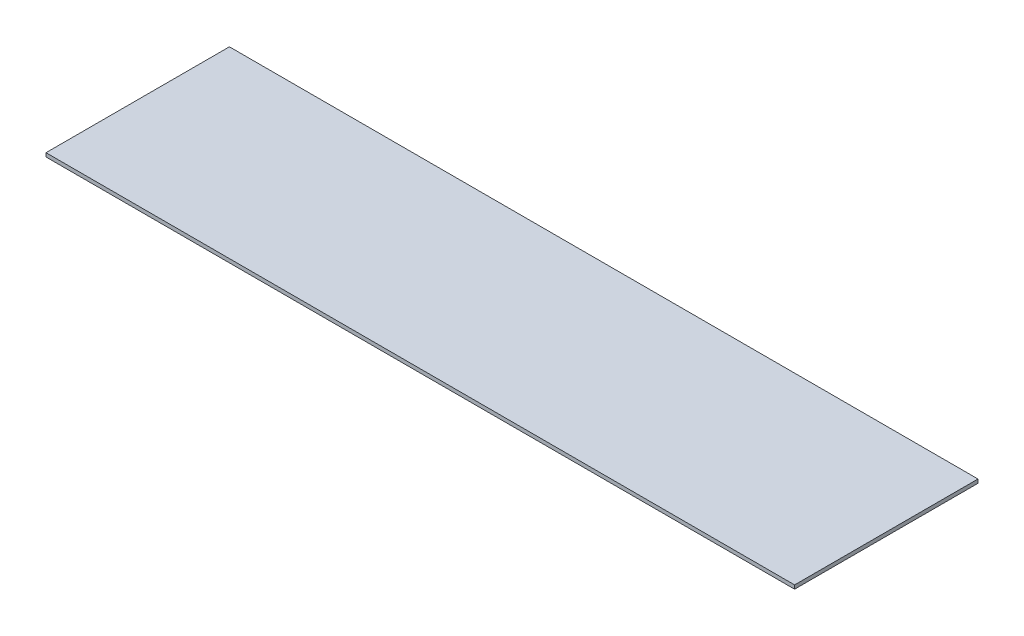
ISO-10303-21;
HEADER;
FILE_DESCRIPTION(('STEP AP214'),'2;1');
FILE_NAME('part.step','',(''),(''),'','','');
FILE_SCHEMA(('AUTOMOTIVE_DESIGN { 1 0 10303 214 1 1 1 1 }'));
ENDSEC;
DATA;
#1=APPLICATION_CONTEXT('core data for automotive mechanical design processes');
#2=APPLICATION_PROTOCOL_DEFINITION('international standard','automotive_design',2000,#1);
#3=PRODUCT_CONTEXT('',#1,'mechanical');
#4=PRODUCT('Part','Part','',(#3));
#5=PRODUCT_RELATED_PRODUCT_CATEGORY('part','',(#4));
#6=PRODUCT_DEFINITION_FORMATION('','',#4);
#7=PRODUCT_DEFINITION_CONTEXT('part definition',#1,'design');
#8=PRODUCT_DEFINITION('design','',#6,#7);
#9=PRODUCT_DEFINITION_SHAPE('','',#8);
#10=(LENGTH_UNIT() NAMED_UNIT(*) SI_UNIT(.MILLI.,.METRE.));
#11=(NAMED_UNIT(*) PLANE_ANGLE_UNIT() SI_UNIT($,.RADIAN.));
#12=(NAMED_UNIT(*) SI_UNIT($,.STERADIAN.) SOLID_ANGLE_UNIT());
#13=UNCERTAINTY_MEASURE_WITH_UNIT(LENGTH_MEASURE(1.E-05),#10,'distance_accuracy_value','');
#14=(GEOMETRIC_REPRESENTATION_CONTEXT(3) GLOBAL_UNCERTAINTY_ASSIGNED_CONTEXT((#13)) GLOBAL_UNIT_ASSIGNED_CONTEXT((#10,
#11,#12)) REPRESENTATION_CONTEXT('',''));
#15=CARTESIAN_POINT('',(0.,0.,0.));
#16=DIRECTION('',(0.,0.,1.));
#17=DIRECTION('',(1.,0.,0.));
#18=AXIS2_PLACEMENT_3D('',#15,#16,#17);
#19=CARTESIAN_POINT('',(400.,0.,0.));
#20=DIRECTION('',(0.,1.,0.));
#21=DIRECTION('',(0.,0.,1.));
#22=AXIS2_PLACEMENT_3D('',#19,#20,#21);
#23=PLANE('',#22);
#24=DIRECTION('',(0.,0.,-1.));
#25=VECTOR('',#24,1.);
#26=CARTESIAN_POINT('',(0.,0.,0.));
#27=LINE('',#26,#25);
#28=CARTESIAN_POINT('',(0.,0.,0.));
#29=VERTEX_POINT('',#28);
#30=CARTESIAN_POINT('',(0.,0.,-98.));
#31=VERTEX_POINT('',#30);
#32=EDGE_CURVE('E98',#29,#31,#27,.T.);
#33=ORIENTED_EDGE('',*,*,#32,.T.);
#34=DIRECTION('',(-1.,0.,0.));
#35=VECTOR('',#34,1.);
#36=CARTESIAN_POINT('',(400.,0.,-98.));
#37=LINE('',#36,#35);
#38=CARTESIAN_POINT('',(400.,0.,-98.));
#39=VERTEX_POINT('',#38);
#40=EDGE_CURVE('E11',#39,#31,#37,.T.);
#41=ORIENTED_EDGE('',*,*,#40,.F.);
#42=DIRECTION('',(0.,0.,-1.));
#43=VECTOR('',#42,1.);
#44=CARTESIAN_POINT('',(400.,0.,0.));
#45=LINE('',#44,#43);
#46=CARTESIAN_POINT('',(400.,0.,0.));
#47=VERTEX_POINT('',#46);
#48=EDGE_CURVE('E86',#47,#39,#45,.T.);
#49=ORIENTED_EDGE('',*,*,#48,.F.);
#50=DIRECTION('',(-1.,0.,0.));
#51=VECTOR('',#50,1.);
#52=CARTESIAN_POINT('',(400.,0.,0.));
#53=LINE('',#52,#51);
#54=EDGE_CURVE('E94',#47,#29,#53,.T.);
#55=ORIENTED_EDGE('',*,*,#54,.T.);
#56=EDGE_LOOP('',(#33,#41,#49,#55));
#57=FACE_BOUND('',#56,.T.);
#58=ADVANCED_FACE('F35',(#57),#23,.F.);
#59=CARTESIAN_POINT('',(400.,0.,-98.));
#60=DIRECTION('',(0.,0.,1.));
#61=DIRECTION('',(1.,0.,0.));
#62=AXIS2_PLACEMENT_3D('',#59,#60,#61);
#63=PLANE('',#62);
#64=DIRECTION('',(0.,1.,0.));
#65=VECTOR('',#64,1.);
#66=CARTESIAN_POINT('',(0.,0.,-98.));
#67=LINE('',#66,#65);
#68=CARTESIAN_POINT('',(0.,2.,-98.));
#69=VERTEX_POINT('',#68);
#70=EDGE_CURVE('E90',#31,#69,#67,.T.);
#71=ORIENTED_EDGE('',*,*,#70,.T.);
#72=DIRECTION('',(-1.,0.,0.));
#73=VECTOR('',#72,1.);
#74=CARTESIAN_POINT('',(400.,2.,-98.));
#75=LINE('',#74,#73);
#76=CARTESIAN_POINT('',(400.,2.,-98.));
#77=VERTEX_POINT('',#76);
#78=EDGE_CURVE('E43',#77,#69,#75,.T.);
#79=ORIENTED_EDGE('',*,*,#78,.F.);
#80=DIRECTION('',(0.,1.,0.));
#81=VECTOR('',#80,1.);
#82=CARTESIAN_POINT('',(400.,0.,-98.));
#83=LINE('',#82,#81);
#84=EDGE_CURVE('E81',#39,#77,#83,.T.);
#85=ORIENTED_EDGE('',*,*,#84,.F.);
#86=ORIENTED_EDGE('',*,*,#40,.T.);
#87=EDGE_LOOP('',(#71,#79,#85,#86));
#88=FACE_BOUND('',#87,.T.);
#89=ADVANCED_FACE('F89',(#88),#63,.F.);
#90=CARTESIAN_POINT('',(400.,2.,0.));
#91=DIRECTION('',(0.,-1.,0.));
#92=DIRECTION('',(0.,0.,-1.));
#93=AXIS2_PLACEMENT_3D('',#90,#91,#92);
#94=PLANE('',#93);
#95=DIRECTION('',(0.,0.,1.));
#96=VECTOR('',#95,1.);
#97=CARTESIAN_POINT('',(0.,2.,0.));
#98=LINE('',#97,#96);
#99=CARTESIAN_POINT('',(0.,2.,0.));
#100=VERTEX_POINT('',#99);
#101=EDGE_CURVE('E68',#69,#100,#98,.T.);
#102=ORIENTED_EDGE('',*,*,#101,.T.);
#103=DIRECTION('',(-1.,0.,0.));
#104=VECTOR('',#103,1.);
#105=CARTESIAN_POINT('',(400.,2.,0.));
#106=LINE('',#105,#104);
#107=CARTESIAN_POINT('',(400.,2.,0.));
#108=VERTEX_POINT('',#107);
#109=EDGE_CURVE('E91',#108,#100,#106,.T.);
#110=ORIENTED_EDGE('',*,*,#109,.F.);
#111=DIRECTION('',(0.,0.,1.));
#112=VECTOR('',#111,1.);
#113=CARTESIAN_POINT('',(400.,2.,0.));
#114=LINE('',#113,#112);
#115=EDGE_CURVE('E84',#77,#108,#114,.T.);
#116=ORIENTED_EDGE('',*,*,#115,.F.);
#117=ORIENTED_EDGE('',*,*,#78,.T.);
#118=EDGE_LOOP('',(#102,#110,#116,#117));
#119=FACE_BOUND('',#118,.T.);
#120=ADVANCED_FACE('F92',(#119),#94,.F.);
#121=CARTESIAN_POINT('',(400.,0.,0.));
#122=DIRECTION('',(0.,0.,-1.));
#123=DIRECTION('',(-1.,0.,0.));
#124=AXIS2_PLACEMENT_3D('',#121,#122,#123);
#125=PLANE('',#124);
#126=DIRECTION('',(0.,-1.,0.));
#127=VECTOR('',#126,1.);
#128=CARTESIAN_POINT('',(0.,0.,0.));
#129=LINE('',#128,#127);
#130=EDGE_CURVE('E74',#100,#29,#129,.T.);
#131=ORIENTED_EDGE('',*,*,#130,.T.);
#132=ORIENTED_EDGE('',*,*,#54,.F.);
#133=DIRECTION('',(0.,-1.,0.));
#134=VECTOR('',#133,1.);
#135=CARTESIAN_POINT('',(400.,0.,0.));
#136=LINE('',#135,#134);
#137=EDGE_CURVE('E51',#108,#47,#136,.T.);
#138=ORIENTED_EDGE('',*,*,#137,.F.);
#139=ORIENTED_EDGE('',*,*,#109,.T.);
#140=EDGE_LOOP('',(#131,#132,#138,#139));
#141=FACE_BOUND('',#140,.T.);
#142=ADVANCED_FACE('F105',(#141),#125,.F.);
#143=CARTESIAN_POINT('',(400.,0.,0.));
#144=DIRECTION('',(1.,0.,0.));
#145=DIRECTION('',(0.,0.,-1.));
#146=AXIS2_PLACEMENT_3D('',#143,#144,#145);
#147=PLANE('',#146);
#148=ORIENTED_EDGE('',*,*,#48,.T.);
#149=ORIENTED_EDGE('',*,*,#84,.T.);
#150=ORIENTED_EDGE('',*,*,#115,.T.);
#151=ORIENTED_EDGE('',*,*,#137,.T.);
#152=EDGE_LOOP('',(#148,#149,#150,#151));
#153=FACE_BOUND('',#152,.T.);
#154=ADVANCED_FACE('F82',(#153),#147,.T.);
#155=CARTESIAN_POINT('',(0.,0.,0.));
#156=DIRECTION('',(1.,0.,0.));
#157=DIRECTION('',(0.,0.,-1.));
#158=AXIS2_PLACEMENT_3D('',#155,#156,#157);
#159=PLANE('',#158);
#160=ORIENTED_EDGE('',*,*,#32,.F.);
#161=ORIENTED_EDGE('',*,*,#130,.F.);
#162=ORIENTED_EDGE('',*,*,#101,.F.);
#163=ORIENTED_EDGE('',*,*,#70,.F.);
#164=EDGE_LOOP('',(#160,#161,#162,#163));
#165=FACE_BOUND('',#164,.T.);
#166=ADVANCED_FACE('F108',(#165),#159,.F.);
#167=CLOSED_SHELL('',(#58,#89,#120,#142,#154,#166));
#168=MANIFOLD_SOLID_BREP('B2',#167);
#169=ADVANCED_BREP_SHAPE_REPRESENTATION('',(#18,#168),#14);
#170=SHAPE_DEFINITION_REPRESENTATION(#9,#169);
ENDSEC;
END-ISO-10303-21;
